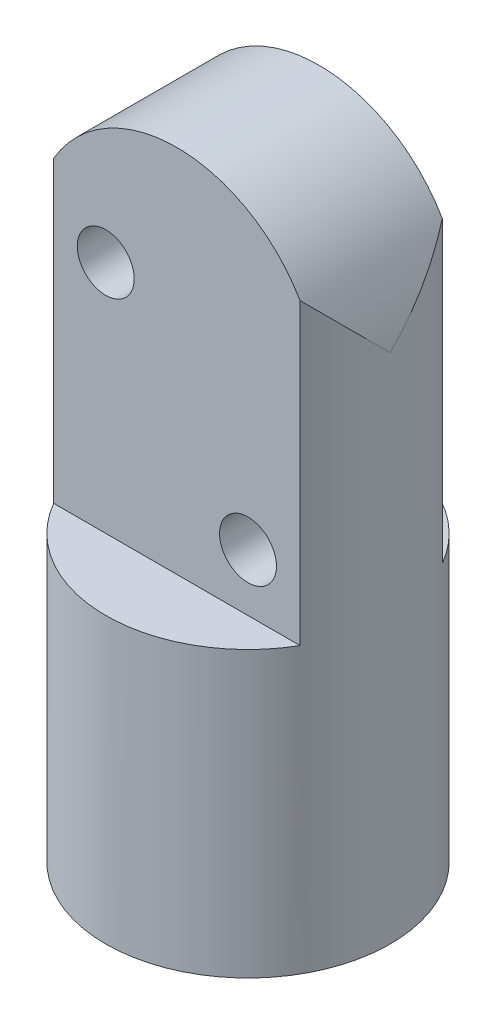
ISO-10303-21;
HEADER;
FILE_DESCRIPTION(('STEP AP214'),'2;1');
FILE_NAME('part.step','',(''),(''),'','','');
FILE_SCHEMA(('AUTOMOTIVE_DESIGN { 1 0 10303 214 1 1 1 1 }'));
ENDSEC;
DATA;
#1=APPLICATION_CONTEXT('core data for automotive mechanical design processes');
#2=APPLICATION_PROTOCOL_DEFINITION('international standard','automotive_design',2000,#1);
#3=PRODUCT_CONTEXT('',#1,'mechanical');
#4=PRODUCT('Part','Part','',(#3));
#5=PRODUCT_RELATED_PRODUCT_CATEGORY('part','',(#4));
#6=PRODUCT_DEFINITION_FORMATION('','',#4);
#7=PRODUCT_DEFINITION_CONTEXT('part definition',#1,'design');
#8=PRODUCT_DEFINITION('design','',#6,#7);
#9=PRODUCT_DEFINITION_SHAPE('','',#8);
#10=(LENGTH_UNIT() NAMED_UNIT(*) SI_UNIT(.MILLI.,.METRE.));
#11=(NAMED_UNIT(*) PLANE_ANGLE_UNIT() SI_UNIT($,.RADIAN.));
#12=(NAMED_UNIT(*) SI_UNIT($,.STERADIAN.) SOLID_ANGLE_UNIT());
#13=UNCERTAINTY_MEASURE_WITH_UNIT(LENGTH_MEASURE(1.E-05),#10,'distance_accuracy_value','');
#14=(GEOMETRIC_REPRESENTATION_CONTEXT(3) GLOBAL_UNCERTAINTY_ASSIGNED_CONTEXT((#13)) GLOBAL_UNIT_ASSIGNED_CONTEXT((#10,
#11,#12)) REPRESENTATION_CONTEXT('',''));
#15=CARTESIAN_POINT('',(0.,0.,0.));
#16=DIRECTION('',(0.,0.,1.));
#17=DIRECTION('',(1.,0.,0.));
#18=AXIS2_PLACEMENT_3D('',#15,#16,#17);
#19=CARTESIAN_POINT('',(0.,90.,-12.5));
#20=DIRECTION('',(0.,0.,-1.));
#21=DIRECTION('',(-1.,0.,0.));
#22=AXIS2_PLACEMENT_3D('',#19,#20,#21);
#23=PLANE('',#22);
#24=CARTESIAN_POINT('',(-12.5,91.224989991992,-12.5));
#25=DIRECTION('',(0.,0.,-1.));
#26=DIRECTION('',(-1.,0.,0.));
#27=AXIS2_PLACEMENT_3D('',#24,#25,#26);
#28=CIRCLE('',#27,5.00000000000001);
#29=CARTESIAN_POINT('',(-17.5,91.224989991992,-12.5));
#30=VERTEX_POINT('',#29);
#31=EDGE_CURVE('E119',#30,#30,#28,.T.);
#32=ORIENTED_EDGE('',*,*,#31,.F.);
#33=EDGE_LOOP('',(#32));
#34=FACE_BOUND('',#33,.T.);
#35=CARTESIAN_POINT('',(12.5,60.,-12.5));
#36=DIRECTION('',(0.,0.,-1.));
#37=DIRECTION('',(-1.,0.,0.));
#38=AXIS2_PLACEMENT_3D('',#35,#36,#37);
#39=CIRCLE('',#38,5.00000000000001);
#40=CARTESIAN_POINT('',(7.5,60.,-12.5));
#41=VERTEX_POINT('',#40);
#42=EDGE_CURVE('E123',#41,#41,#39,.T.);
#43=ORIENTED_EDGE('',*,*,#42,.F.);
#44=EDGE_LOOP('',(#43));
#45=FACE_BOUND('',#44,.T.);
#46=CARTESIAN_POINT('',(0.,90.,-12.5));
#47=DIRECTION('',(0.,0.,1.));
#48=DIRECTION('',(-1.,0.,0.));
#49=AXIS2_PLACEMENT_3D('',#46,#47,#48);
#50=CIRCLE('',#49,25.);
#51=CARTESIAN_POINT('',(21.650635094611,102.5,-12.5));
#52=VERTEX_POINT('',#51);
#53=CARTESIAN_POINT('',(-21.650635094611,102.5,-12.5));
#54=VERTEX_POINT('',#53);
#55=EDGE_CURVE('E86',#52,#54,#50,.T.);
#56=ORIENTED_EDGE('',*,*,#55,.F.);
#57=DIRECTION('',(0.,-1.,0.));
#58=VECTOR('',#57,1.);
#59=CARTESIAN_POINT('',(21.650635094611,115.,-12.5));
#60=LINE('',#59,#58);
#61=CARTESIAN_POINT('',(21.650635094611,50.,-12.5));
#62=VERTEX_POINT('',#61);
#63=EDGE_CURVE('E85',#52,#62,#60,.T.);
#64=ORIENTED_EDGE('',*,*,#63,.T.);
#65=DIRECTION('',(1.,0.,0.));
#66=VECTOR('',#65,1.);
#67=CARTESIAN_POINT('',(-25.,50.,-12.5));
#68=LINE('',#67,#66);
#69=CARTESIAN_POINT('',(-21.650635094611,50.,-12.5));
#70=VERTEX_POINT('',#69);
#71=EDGE_CURVE('E11',#70,#62,#68,.T.);
#72=ORIENTED_EDGE('',*,*,#71,.F.);
#73=DIRECTION('',(0.,-1.,0.));
#74=VECTOR('',#73,1.);
#75=CARTESIAN_POINT('',(-21.650635094611,115.,-12.5));
#76=LINE('',#75,#74);
#77=EDGE_CURVE('E51',#54,#70,#76,.T.);
#78=ORIENTED_EDGE('',*,*,#77,.F.);
#79=EDGE_LOOP('',(#56,#64,#72,#78));
#80=FACE_BOUND('',#79,.T.);
#81=ADVANCED_FACE('F34',(#34,#45,#80),#23,.T.);
#82=CARTESIAN_POINT('',(0.,90.,12.5));
#83=DIRECTION('',(0.,0.,-1.));
#84=DIRECTION('',(-1.,0.,0.));
#85=AXIS2_PLACEMENT_3D('',#82,#83,#84);
#86=CYLINDRICAL_SURFACE('',#85,25.);
#87=CARTESIAN_POINT('',(0.,90.,0.));
#88=DIRECTION('',(0.,-0.707106781186547,-0.707106781186547));
#89=DIRECTION('',(0.,0.707106781186547,-0.707106781186547));
#90=AXIS2_PLACEMENT_3D('',#87,#88,#89);
#91=ELLIPSE('',#90,35.3553390593274,25.);
#92=CARTESIAN_POINT('',(25.,90.,0.));
#93=VERTEX_POINT('',#92);
#94=EDGE_CURVE('E88',#52,#93,#91,.T.);
#95=ORIENTED_EDGE('',*,*,#94,.F.);
#96=ORIENTED_EDGE('',*,*,#55,.T.);
#97=CARTESIAN_POINT('',(0.,90.,0.));
#98=DIRECTION('',(0.,-0.707106781186547,-0.707106781186547));
#99=DIRECTION('',(0.,0.707106781186547,-0.707106781186547));
#100=AXIS2_PLACEMENT_3D('',#97,#98,#99);
#101=ELLIPSE('',#100,35.3553390593274,25.);
#102=CARTESIAN_POINT('',(-25.,90.,0.));
#103=VERTEX_POINT('',#102);
#104=EDGE_CURVE('E106',#103,#54,#101,.T.);
#105=ORIENTED_EDGE('',*,*,#104,.F.);
#106=CARTESIAN_POINT('',(0.,90.,0.));
#107=DIRECTION('',(0.,0.707106781186547,-0.707106781186547));
#108=DIRECTION('',(0.,-0.707106781186547,-0.707106781186547));
#109=AXIS2_PLACEMENT_3D('',#106,#107,#108);
#110=ELLIPSE('',#109,35.3553390593274,25.);
#111=CARTESIAN_POINT('',(-21.650635094611,102.5,12.5));
#112=VERTEX_POINT('',#111);
#113=EDGE_CURVE('E115',#112,#103,#110,.F.);
#114=ORIENTED_EDGE('',*,*,#113,.F.);
#115=CARTESIAN_POINT('',(0.,90.,12.5));
#116=DIRECTION('',(0.,0.,1.));
#117=DIRECTION('',(-1.,0.,0.));
#118=AXIS2_PLACEMENT_3D('',#115,#116,#117);
#119=CIRCLE('',#118,25.);
#120=CARTESIAN_POINT('',(21.650635094611,102.5,12.5));
#121=VERTEX_POINT('',#120);
#122=EDGE_CURVE('E105',#121,#112,#119,.T.);
#123=ORIENTED_EDGE('',*,*,#122,.F.);
#124=CARTESIAN_POINT('',(0.,90.,0.));
#125=DIRECTION('',(0.,0.707106781186547,-0.707106781186547));
#126=DIRECTION('',(0.,-0.707106781186547,-0.707106781186547));
#127=AXIS2_PLACEMENT_3D('',#124,#125,#126);
#128=ELLIPSE('',#127,35.3553390593274,25.);
#129=EDGE_CURVE('E111',#121,#93,#128,.T.);
#130=ORIENTED_EDGE('',*,*,#129,.T.);
#131=EDGE_LOOP('',(#95,#96,#105,#114,#123,#130));
#132=FACE_BOUND('',#131,.T.);
#133=ADVANCED_FACE('F138',(#132),#86,.T.);
#134=CARTESIAN_POINT('',(0.,90.,12.5));
#135=DIRECTION('',(0.,0.,-1.));
#136=DIRECTION('',(-1.,0.,0.));
#137=AXIS2_PLACEMENT_3D('',#134,#135,#136);
#138=PLANE('',#137);
#139=CARTESIAN_POINT('',(-12.5,91.224989991992,12.5));
#140=DIRECTION('',(0.,0.,1.));
#141=DIRECTION('',(1.,0.,0.));
#142=AXIS2_PLACEMENT_3D('',#139,#140,#141);
#143=CIRCLE('',#142,5.00000000000001);
#144=CARTESIAN_POINT('',(-7.49999999999999,91.224989991992,12.5));
#145=VERTEX_POINT('',#144);
#146=EDGE_CURVE('E126',#145,#145,#143,.T.);
#147=ORIENTED_EDGE('',*,*,#146,.F.);
#148=EDGE_LOOP('',(#147));
#149=FACE_BOUND('',#148,.T.);
#150=CARTESIAN_POINT('',(12.5,60.,12.5));
#151=DIRECTION('',(0.,0.,1.));
#152=DIRECTION('',(1.,0.,0.));
#153=AXIS2_PLACEMENT_3D('',#150,#151,#152);
#154=CIRCLE('',#153,5.00000000000001);
#155=CARTESIAN_POINT('',(17.5,60.,12.5));
#156=VERTEX_POINT('',#155);
#157=EDGE_CURVE('E127',#156,#156,#154,.T.);
#158=ORIENTED_EDGE('',*,*,#157,.F.);
#159=EDGE_LOOP('',(#158));
#160=FACE_BOUND('',#159,.T.);
#161=DIRECTION('',(0.,-1.,0.));
#162=VECTOR('',#161,1.);
#163=CARTESIAN_POINT('',(-21.650635094611,115.,12.5));
#164=LINE('',#163,#162);
#165=CARTESIAN_POINT('',(-21.650635094611,50.,12.5));
#166=VERTEX_POINT('',#165);
#167=EDGE_CURVE('E89',#112,#166,#164,.T.);
#168=ORIENTED_EDGE('',*,*,#167,.T.);
#169=DIRECTION('',(1.,0.,0.));
#170=VECTOR('',#169,1.);
#171=CARTESIAN_POINT('',(-25.,50.,12.5));
#172=LINE('',#171,#170);
#173=CARTESIAN_POINT('',(21.650635094611,50.,12.5));
#174=VERTEX_POINT('',#173);
#175=EDGE_CURVE('E43',#166,#174,#172,.T.);
#176=ORIENTED_EDGE('',*,*,#175,.T.);
#177=DIRECTION('',(0.,-1.,0.));
#178=VECTOR('',#177,1.);
#179=CARTESIAN_POINT('',(21.650635094611,115.,12.5));
#180=LINE('',#179,#178);
#181=EDGE_CURVE('E58',#121,#174,#180,.T.);
#182=ORIENTED_EDGE('',*,*,#181,.F.);
#183=ORIENTED_EDGE('',*,*,#122,.T.);
#184=EDGE_LOOP('',(#168,#176,#182,#183));
#185=FACE_BOUND('',#184,.T.);
#186=ADVANCED_FACE('F135',(#149,#160,#185),#138,.F.);
#187=CARTESIAN_POINT('',(0.,50.,0.));
#188=DIRECTION('',(0.,1.,0.));
#189=DIRECTION('',(0.,0.,1.));
#190=AXIS2_PLACEMENT_3D('',#187,#188,#189);
#191=PLANE('',#190);
#192=CARTESIAN_POINT('',(0.,50.,0.));
#193=DIRECTION('',(0.,1.,0.));
#194=DIRECTION('',(0.,0.,1.));
#195=AXIS2_PLACEMENT_3D('',#192,#193,#194);
#196=CIRCLE('',#195,25.);
#197=EDGE_CURVE('E93',#62,#70,#196,.T.);
#198=ORIENTED_EDGE('',*,*,#197,.T.);
#199=ORIENTED_EDGE('',*,*,#71,.T.);
#200=EDGE_LOOP('',(#198,#199));
#201=FACE_BOUND('',#200,.T.);
#202=ADVANCED_FACE('F92',(#201),#191,.T.);
#203=ORIENTED_EDGE('',*,*,#175,.F.);
#204=EDGE_CURVE('E95',#166,#174,#196,.T.);
#205=ORIENTED_EDGE('',*,*,#204,.T.);
#206=EDGE_LOOP('',(#203,#205));
#207=FACE_BOUND('',#206,.T.);
#208=ADVANCED_FACE('F146',(#207),#191,.T.);
#209=CARTESIAN_POINT('',(0.,0.,0.));
#210=DIRECTION('',(0.,1.,0.));
#211=DIRECTION('',(0.,0.,1.));
#212=AXIS2_PLACEMENT_3D('',#209,#210,#211);
#213=PLANE('',#212);
#214=CARTESIAN_POINT('',(0.,0.,0.));
#215=DIRECTION('',(0.,1.,0.));
#216=DIRECTION('',(0.,0.,1.));
#217=AXIS2_PLACEMENT_3D('',#214,#215,#216);
#218=CIRCLE('',#217,25.);
#219=CARTESIAN_POINT('',(0.,0.,25.));
#220=VERTEX_POINT('',#219);
#221=EDGE_CURVE('E38',#220,#220,#218,.T.);
#222=ORIENTED_EDGE('',*,*,#221,.F.);
#223=EDGE_LOOP('',(#222));
#224=FACE_BOUND('',#223,.T.);
#225=CARTESIAN_POINT('',(0.,0.,0.));
#226=DIRECTION('',(0.,1.,0.));
#227=DIRECTION('',(0.,0.,1.));
#228=AXIS2_PLACEMENT_3D('',#225,#226,#227);
#229=CIRCLE('',#228,10.);
#230=CARTESIAN_POINT('',(0.,0.,10.));
#231=VERTEX_POINT('',#230);
#232=EDGE_CURVE('E99',#231,#231,#229,.T.);
#233=ORIENTED_EDGE('',*,*,#232,.T.);
#234=EDGE_LOOP('',(#233));
#235=FACE_BOUND('',#234,.T.);
#236=ADVANCED_FACE('F148',(#224,#235),#213,.F.);
#237=CARTESIAN_POINT('',(0.,50.,0.));
#238=DIRECTION('',(0.,-1.,0.));
#239=DIRECTION('',(0.,0.,-1.));
#240=AXIS2_PLACEMENT_3D('',#237,#238,#239);
#241=CYLINDRICAL_SURFACE('',#240,25.);
#242=ORIENTED_EDGE('',*,*,#197,.F.);
#243=ORIENTED_EDGE('',*,*,#63,.F.);
#244=ORIENTED_EDGE('',*,*,#94,.T.);
#245=ORIENTED_EDGE('',*,*,#129,.F.);
#246=ORIENTED_EDGE('',*,*,#181,.T.);
#247=ORIENTED_EDGE('',*,*,#204,.F.);
#248=ORIENTED_EDGE('',*,*,#167,.F.);
#249=ORIENTED_EDGE('',*,*,#113,.T.);
#250=ORIENTED_EDGE('',*,*,#104,.T.);
#251=ORIENTED_EDGE('',*,*,#77,.T.);
#252=EDGE_LOOP('',(#242,#243,#244,#245,#246,#247,#248,#249,#250,#251));
#253=FACE_BOUND('',#252,.T.);
#254=ORIENTED_EDGE('',*,*,#221,.T.);
#255=EDGE_LOOP('',(#254));
#256=FACE_BOUND('',#255,.T.);
#257=ADVANCED_FACE('F36',(#253,#256),#241,.T.);
#258=CARTESIAN_POINT('',(0.,50.,0.));
#259=DIRECTION('',(0.,-1.,0.));
#260=DIRECTION('',(0.,0.,-1.));
#261=AXIS2_PLACEMENT_3D('',#258,#259,#260);
#262=CYLINDRICAL_SURFACE('',#261,10.);
#263=CARTESIAN_POINT('',(0.,50.,0.));
#264=DIRECTION('',(0.,1.,0.));
#265=DIRECTION('',(0.,0.,1.));
#266=AXIS2_PLACEMENT_3D('',#263,#264,#265);
#267=CIRCLE('',#266,10.);
#268=CARTESIAN_POINT('',(0.,50.,10.));
#269=VERTEX_POINT('',#268);
#270=EDGE_CURVE('E102',#269,#269,#267,.T.);
#271=ORIENTED_EDGE('',*,*,#270,.T.);
#272=EDGE_LOOP('',(#271));
#273=FACE_BOUND('',#272,.T.);
#274=ORIENTED_EDGE('',*,*,#232,.F.);
#275=EDGE_LOOP('',(#274));
#276=FACE_BOUND('',#275,.T.);
#277=ADVANCED_FACE('F171',(#273,#276),#262,.F.);
#278=CARTESIAN_POINT('',(-25.,50.,12.5));
#279=DIRECTION('',(0.,1.,0.));
#280=DIRECTION('',(0.,0.,1.));
#281=AXIS2_PLACEMENT_3D('',#278,#279,#280);
#282=PLANE('',#281);
#283=ORIENTED_EDGE('',*,*,#270,.F.);
#284=EDGE_LOOP('',(#283));
#285=FACE_BOUND('',#284,.T.);
#286=ADVANCED_FACE('F168',(#285),#282,.F.);
#287=CARTESIAN_POINT('',(12.5,60.,-25.));
#288=DIRECTION('',(0.,0.,1.));
#289=DIRECTION('',(1.,0.,0.));
#290=AXIS2_PLACEMENT_3D('',#287,#288,#289);
#291=CYLINDRICAL_SURFACE('',#290,5.00000000000001);
#292=ORIENTED_EDGE('',*,*,#42,.T.);
#293=EDGE_LOOP('',(#292));
#294=FACE_BOUND('',#293,.T.);
#295=ORIENTED_EDGE('',*,*,#157,.T.);
#296=EDGE_LOOP('',(#295));
#297=FACE_BOUND('',#296,.T.);
#298=ADVANCED_FACE('F170',(#294,#297),#291,.F.);
#299=CARTESIAN_POINT('',(-12.5,91.224989991992,-25.));
#300=DIRECTION('',(0.,0.,1.));
#301=DIRECTION('',(1.,0.,0.));
#302=AXIS2_PLACEMENT_3D('',#299,#300,#301);
#303=CYLINDRICAL_SURFACE('',#302,5.00000000000001);
#304=ORIENTED_EDGE('',*,*,#31,.T.);
#305=EDGE_LOOP('',(#304));
#306=FACE_BOUND('',#305,.T.);
#307=ORIENTED_EDGE('',*,*,#146,.T.);
#308=EDGE_LOOP('',(#307));
#309=FACE_BOUND('',#308,.T.);
#310=ADVANCED_FACE('F133',(#306,#309),#303,.F.);
#311=CLOSED_SHELL('',(#81,#133,#186,#202,#208,#236,#257,#277,#286,#298,#310));
#312=MANIFOLD_SOLID_BREP('B2',#311);
#313=ADVANCED_BREP_SHAPE_REPRESENTATION('',(#18,#312),#14);
#314=SHAPE_DEFINITION_REPRESENTATION(#9,#313);
ENDSEC;
END-ISO-10303-21;
